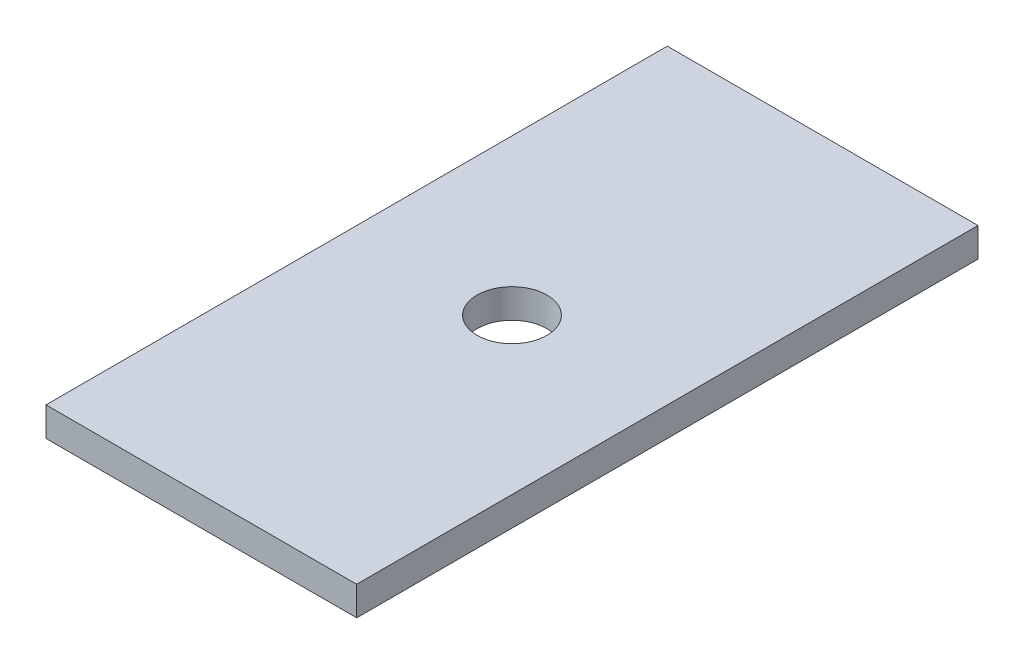
ISO-10303-21;
HEADER;
FILE_DESCRIPTION(('STEP AP214'),'2;1');
FILE_NAME('part.step','',(''),(''),'','','');
FILE_SCHEMA(('AUTOMOTIVE_DESIGN { 1 0 10303 214 1 1 1 1 }'));
ENDSEC;
DATA;
#1=APPLICATION_CONTEXT('core data for automotive mechanical design processes');
#2=APPLICATION_PROTOCOL_DEFINITION('international standard','automotive_design',2000,#1);
#3=PRODUCT_CONTEXT('',#1,'mechanical');
#4=PRODUCT('Part','Part','',(#3));
#5=PRODUCT_RELATED_PRODUCT_CATEGORY('part','',(#4));
#6=PRODUCT_DEFINITION_FORMATION('','',#4);
#7=PRODUCT_DEFINITION_CONTEXT('part definition',#1,'design');
#8=PRODUCT_DEFINITION('design','',#6,#7);
#9=PRODUCT_DEFINITION_SHAPE('','',#8);
#10=(LENGTH_UNIT() NAMED_UNIT(*) SI_UNIT(.MILLI.,.METRE.));
#11=(NAMED_UNIT(*) PLANE_ANGLE_UNIT() SI_UNIT($,.RADIAN.));
#12=(NAMED_UNIT(*) SI_UNIT($,.STERADIAN.) SOLID_ANGLE_UNIT());
#13=UNCERTAINTY_MEASURE_WITH_UNIT(LENGTH_MEASURE(1.E-05),#10,'distance_accuracy_value','');
#14=(GEOMETRIC_REPRESENTATION_CONTEXT(3) GLOBAL_UNCERTAINTY_ASSIGNED_CONTEXT((#13)) GLOBAL_UNIT_ASSIGNED_CONTEXT((#10,
#11,#12)) REPRESENTATION_CONTEXT('',''));
#15=CARTESIAN_POINT('',(0.,0.,0.));
#16=DIRECTION('',(0.,0.,1.));
#17=DIRECTION('',(1.,0.,0.));
#18=AXIS2_PLACEMENT_3D('',#15,#16,#17);
#19=CARTESIAN_POINT('',(0.,11.90625,0.));
#20=DIRECTION('',(0.,-1.,0.));
#21=DIRECTION('',(0.,0.,-1.));
#22=AXIS2_PLACEMENT_3D('',#19,#20,#21);
#23=PLANE('',#22);
#24=DIRECTION('',(0.,0.,1.));
#25=VECTOR('',#24,1.);
#26=CARTESIAN_POINT('',(0.,11.90625,0.));
#27=LINE('',#26,#25);
#28=CARTESIAN_POINT('',(0.,11.90625,-171.45));
#29=VERTEX_POINT('',#28);
#30=CARTESIAN_POINT('',(0.,11.90625,82.55));
#31=VERTEX_POINT('',#30);
#32=EDGE_CURVE('E43',#29,#31,#27,.T.);
#33=ORIENTED_EDGE('',*,*,#32,.T.);
#34=DIRECTION('',(1.,0.,0.));
#35=VECTOR('',#34,1.);
#36=CARTESIAN_POINT('',(127.,11.90625,82.55));
#37=LINE('',#36,#35);
#38=CARTESIAN_POINT('',(127.,11.90625,82.55));
#39=VERTEX_POINT('',#38);
#40=EDGE_CURVE('E91',#31,#39,#37,.T.);
#41=ORIENTED_EDGE('',*,*,#40,.T.);
#42=DIRECTION('',(0.,0.,-1.));
#43=VECTOR('',#42,1.);
#44=CARTESIAN_POINT('',(127.,11.90625,0.));
#45=LINE('',#44,#43);
#46=CARTESIAN_POINT('',(127.,11.90625,-171.45));
#47=VERTEX_POINT('',#46);
#48=EDGE_CURVE('E11',#39,#47,#45,.T.);
#49=ORIENTED_EDGE('',*,*,#48,.T.);
#50=DIRECTION('',(-1.,0.,0.));
#51=VECTOR('',#50,1.);
#52=CARTESIAN_POINT('',(0.,11.90625,-171.45));
#53=LINE('',#52,#51);
#54=EDGE_CURVE('E96',#47,#29,#53,.T.);
#55=ORIENTED_EDGE('',*,*,#54,.T.);
#56=EDGE_LOOP('',(#33,#41,#49,#55));
#57=FACE_BOUND('',#56,.T.);
#58=CARTESIAN_POINT('',(63.5,11.90625,-44.45));
#59=DIRECTION('',(0.,1.,0.));
#60=DIRECTION('',(0.,0.,1.));
#61=AXIS2_PLACEMENT_3D('',#58,#59,#60);
#62=CIRCLE('',#61,14.2875);
#63=CARTESIAN_POINT('',(63.5,11.90625,-30.1625));
#64=VERTEX_POINT('',#63);
#65=EDGE_CURVE('E81',#64,#64,#62,.T.);
#66=ORIENTED_EDGE('',*,*,#65,.F.);
#67=EDGE_LOOP('',(#66));
#68=FACE_BOUND('',#67,.T.);
#69=ADVANCED_FACE('F33',(#57,#68),#23,.F.);
#70=CARTESIAN_POINT('',(0.,0.,0.));
#71=DIRECTION('',(0.,-1.,0.));
#72=DIRECTION('',(0.,0.,-1.));
#73=AXIS2_PLACEMENT_3D('',#70,#71,#72);
#74=PLANE('',#73);
#75=DIRECTION('',(0.,0.,1.));
#76=VECTOR('',#75,1.);
#77=CARTESIAN_POINT('',(0.,0.,0.));
#78=LINE('',#77,#76);
#79=CARTESIAN_POINT('',(0.,0.,-171.45));
#80=VERTEX_POINT('',#79);
#81=CARTESIAN_POINT('',(0.,0.,82.55));
#82=VERTEX_POINT('',#81);
#83=EDGE_CURVE('E64',#80,#82,#78,.T.);
#84=ORIENTED_EDGE('',*,*,#83,.F.);
#85=DIRECTION('',(-1.,0.,0.));
#86=VECTOR('',#85,1.);
#87=CARTESIAN_POINT('',(0.,0.,-171.45));
#88=LINE('',#87,#86);
#89=CARTESIAN_POINT('',(127.,0.,-171.45));
#90=VERTEX_POINT('',#89);
#91=EDGE_CURVE('E100',#90,#80,#88,.T.);
#92=ORIENTED_EDGE('',*,*,#91,.F.);
#93=DIRECTION('',(0.,0.,-1.));
#94=VECTOR('',#93,1.);
#95=CARTESIAN_POINT('',(127.,0.,0.));
#96=LINE('',#95,#94);
#97=CARTESIAN_POINT('',(127.,0.,82.55));
#98=VERTEX_POINT('',#97);
#99=EDGE_CURVE('E37',#98,#90,#96,.T.);
#100=ORIENTED_EDGE('',*,*,#99,.F.);
#101=DIRECTION('',(1.,0.,0.));
#102=VECTOR('',#101,1.);
#103=CARTESIAN_POINT('',(127.,0.,82.55));
#104=LINE('',#103,#102);
#105=EDGE_CURVE('E83',#82,#98,#104,.T.);
#106=ORIENTED_EDGE('',*,*,#105,.F.);
#107=EDGE_LOOP('',(#84,#92,#100,#106));
#108=FACE_BOUND('',#107,.T.);
#109=CARTESIAN_POINT('',(63.5,0.,-44.45));
#110=DIRECTION('',(0.,1.,0.));
#111=DIRECTION('',(0.,0.,1.));
#112=AXIS2_PLACEMENT_3D('',#109,#110,#111);
#113=CIRCLE('',#112,14.2875);
#114=CARTESIAN_POINT('',(63.5,0.,-30.1625));
#115=VERTEX_POINT('',#114);
#116=EDGE_CURVE('E103',#115,#115,#113,.T.);
#117=ORIENTED_EDGE('',*,*,#116,.T.);
#118=EDGE_LOOP('',(#117));
#119=FACE_BOUND('',#118,.T.);
#120=ADVANCED_FACE('F84',(#108,#119),#74,.T.);
#121=CARTESIAN_POINT('',(0.,11.90625,0.));
#122=DIRECTION('',(1.,0.,0.));
#123=DIRECTION('',(0.,0.,-1.));
#124=AXIS2_PLACEMENT_3D('',#121,#122,#123);
#125=PLANE('',#124);
#126=ORIENTED_EDGE('',*,*,#83,.T.);
#127=DIRECTION('',(0.,1.,0.));
#128=VECTOR('',#127,1.);
#129=CARTESIAN_POINT('',(0.,-151.471127611832,82.55));
#130=LINE('',#129,#128);
#131=EDGE_CURVE('E77',#82,#31,#130,.T.);
#132=ORIENTED_EDGE('',*,*,#131,.T.);
#133=ORIENTED_EDGE('',*,*,#32,.F.);
#134=DIRECTION('',(0.,1.,0.));
#135=VECTOR('',#134,1.);
#136=CARTESIAN_POINT('',(0.,-151.471127611832,-171.45));
#137=LINE('',#136,#135);
#138=EDGE_CURVE('E79',#80,#29,#137,.T.);
#139=ORIENTED_EDGE('',*,*,#138,.F.);
#140=EDGE_LOOP('',(#126,#132,#133,#139));
#141=FACE_BOUND('',#140,.T.);
#142=ADVANCED_FACE('F35',(#141),#125,.F.);
#143=CARTESIAN_POINT('',(127.,11.90625,0.));
#144=DIRECTION('',(-1.,0.,0.));
#145=DIRECTION('',(0.,0.,1.));
#146=AXIS2_PLACEMENT_3D('',#143,#144,#145);
#147=PLANE('',#146);
#148=ORIENTED_EDGE('',*,*,#99,.T.);
#149=DIRECTION('',(0.,1.,0.));
#150=VECTOR('',#149,1.);
#151=CARTESIAN_POINT('',(127.,-151.471127611832,-171.45));
#152=LINE('',#151,#150);
#153=EDGE_CURVE('E99',#90,#47,#152,.T.);
#154=ORIENTED_EDGE('',*,*,#153,.T.);
#155=ORIENTED_EDGE('',*,*,#48,.F.);
#156=DIRECTION('',(0.,1.,0.));
#157=VECTOR('',#156,1.);
#158=CARTESIAN_POINT('',(127.,-151.471127611832,82.55));
#159=LINE('',#158,#157);
#160=EDGE_CURVE('E87',#98,#39,#159,.T.);
#161=ORIENTED_EDGE('',*,*,#160,.F.);
#162=EDGE_LOOP('',(#148,#154,#155,#161));
#163=FACE_BOUND('',#162,.T.);
#164=ADVANCED_FACE('F110',(#163),#147,.F.);
#165=CARTESIAN_POINT('',(63.5,11.90625,-44.45));
#166=DIRECTION('',(0.,-1.,0.));
#167=DIRECTION('',(0.,0.,-1.));
#168=AXIS2_PLACEMENT_3D('',#165,#166,#167);
#169=CYLINDRICAL_SURFACE('',#168,14.2875);
#170=ORIENTED_EDGE('',*,*,#65,.T.);
#171=EDGE_LOOP('',(#170));
#172=FACE_BOUND('',#171,.T.);
#173=ORIENTED_EDGE('',*,*,#116,.F.);
#174=EDGE_LOOP('',(#173));
#175=FACE_BOUND('',#174,.T.);
#176=ADVANCED_FACE('F120',(#172,#175),#169,.F.);
#177=CARTESIAN_POINT('',(0.,-151.471127611832,-171.45));
#178=DIRECTION('',(0.,0.,-1.));
#179=DIRECTION('',(-1.,0.,0.));
#180=AXIS2_PLACEMENT_3D('',#177,#178,#179);
#181=PLANE('',#180);
#182=ORIENTED_EDGE('',*,*,#153,.F.);
#183=ORIENTED_EDGE('',*,*,#91,.T.);
#184=ORIENTED_EDGE('',*,*,#138,.T.);
#185=ORIENTED_EDGE('',*,*,#54,.F.);
#186=EDGE_LOOP('',(#182,#183,#184,#185));
#187=FACE_BOUND('',#186,.T.);
#188=ADVANCED_FACE('F114',(#187),#181,.T.);
#189=CARTESIAN_POINT('',(127.,-151.471127611832,82.55));
#190=DIRECTION('',(0.,0.,1.));
#191=DIRECTION('',(1.,0.,0.));
#192=AXIS2_PLACEMENT_3D('',#189,#190,#191);
#193=PLANE('',#192);
#194=ORIENTED_EDGE('',*,*,#131,.F.);
#195=ORIENTED_EDGE('',*,*,#105,.T.);
#196=ORIENTED_EDGE('',*,*,#160,.T.);
#197=ORIENTED_EDGE('',*,*,#40,.F.);
#198=EDGE_LOOP('',(#194,#195,#196,#197));
#199=FACE_BOUND('',#198,.T.);
#200=ADVANCED_FACE('F89',(#199),#193,.T.);
#201=CLOSED_SHELL('',(#69,#120,#142,#164,#176,#188,#200));
#202=MANIFOLD_SOLID_BREP('B2',#201);
#203=ADVANCED_BREP_SHAPE_REPRESENTATION('',(#18,#202),#14);
#204=SHAPE_DEFINITION_REPRESENTATION(#9,#203);
ENDSEC;
END-ISO-10303-21;
